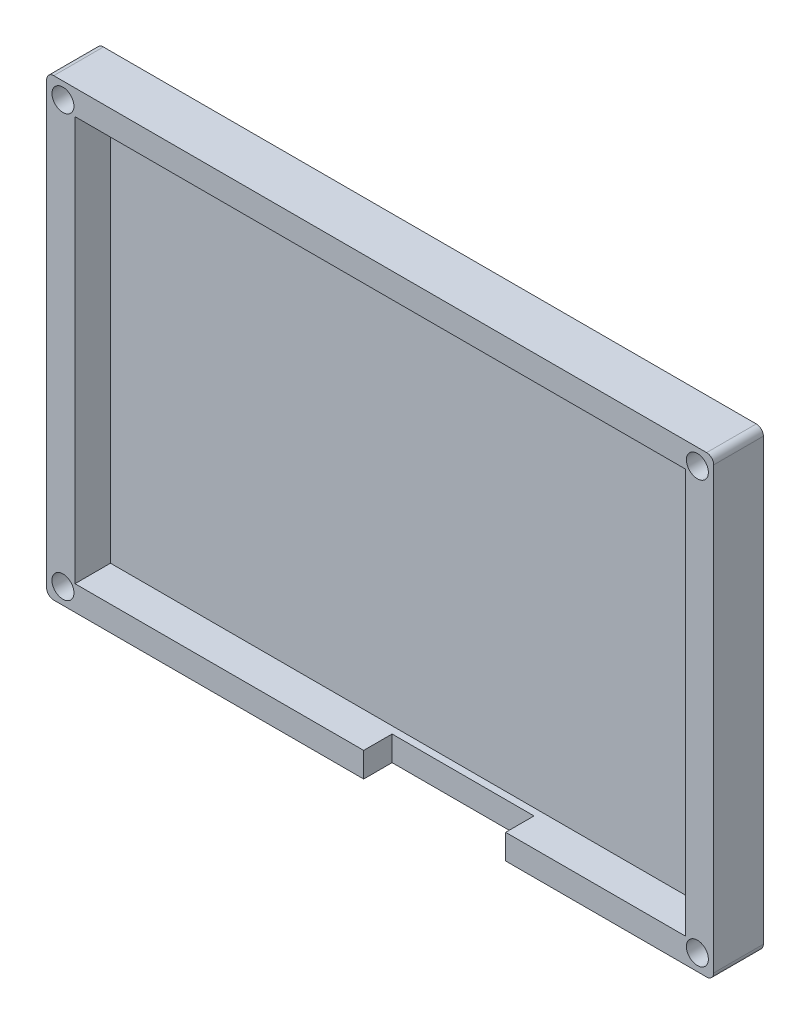
ISO-10303-21;
HEADER;
FILE_DESCRIPTION(('STEP AP214'),'2;1');
FILE_NAME('part.step','',(''),(''),'','','');
FILE_SCHEMA(('AUTOMOTIVE_DESIGN { 1 0 10303 214 1 1 1 1 }'));
ENDSEC;
DATA;
#1=APPLICATION_CONTEXT('core data for automotive mechanical design processes');
#2=APPLICATION_PROTOCOL_DEFINITION('international standard','automotive_design',2000,#1);
#3=PRODUCT_CONTEXT('',#1,'mechanical');
#4=PRODUCT('Part','Part','',(#3));
#5=PRODUCT_RELATED_PRODUCT_CATEGORY('part','',(#4));
#6=PRODUCT_DEFINITION_FORMATION('','',#4);
#7=PRODUCT_DEFINITION_CONTEXT('part definition',#1,'design');
#8=PRODUCT_DEFINITION('design','',#6,#7);
#9=PRODUCT_DEFINITION_SHAPE('','',#8);
#10=(LENGTH_UNIT() NAMED_UNIT(*) SI_UNIT(.MILLI.,.METRE.));
#11=(NAMED_UNIT(*) PLANE_ANGLE_UNIT() SI_UNIT($,.RADIAN.));
#12=(NAMED_UNIT(*) SI_UNIT($,.STERADIAN.) SOLID_ANGLE_UNIT());
#13=UNCERTAINTY_MEASURE_WITH_UNIT(LENGTH_MEASURE(1.E-05),#10,'distance_accuracy_value','');
#14=(GEOMETRIC_REPRESENTATION_CONTEXT(3) GLOBAL_UNCERTAINTY_ASSIGNED_CONTEXT((#13)) GLOBAL_UNIT_ASSIGNED_CONTEXT((#10,
#11,#12)) REPRESENTATION_CONTEXT('',''));
#15=CARTESIAN_POINT('',(0.,0.,0.));
#16=DIRECTION('',(0.,0.,1.));
#17=DIRECTION('',(1.,0.,0.));
#18=AXIS2_PLACEMENT_3D('',#15,#16,#17);
#19=CARTESIAN_POINT('',(47.,-32.,7.));
#20=DIRECTION('',(-1.,0.,0.));
#21=DIRECTION('',(0.,0.,1.));
#22=AXIS2_PLACEMENT_3D('',#19,#20,#21);
#23=PLANE('',#22);
#24=DIRECTION('',(0.,1.,0.));
#25=VECTOR('',#24,1.);
#26=CARTESIAN_POINT('',(47.,-32.,7.));
#27=LINE('',#26,#25);
#28=CARTESIAN_POINT('',(47.,-31.,7.));
#29=VERTEX_POINT('',#28);
#30=CARTESIAN_POINT('',(47.,31.,7.));
#31=VERTEX_POINT('',#30);
#32=EDGE_CURVE('E265',#29,#31,#27,.T.);
#33=ORIENTED_EDGE('',*,*,#32,.F.);
#34=DIRECTION('',(0.,0.,-1.));
#35=VECTOR('',#34,1.);
#36=CARTESIAN_POINT('',(47.,-31.,7.));
#37=LINE('',#36,#35);
#38=CARTESIAN_POINT('',(47.,-31.,0.));
#39=VERTEX_POINT('',#38);
#40=EDGE_CURVE('E299',#29,#39,#37,.T.);
#41=ORIENTED_EDGE('',*,*,#40,.T.);
#42=DIRECTION('',(0.,1.,0.));
#43=VECTOR('',#42,1.);
#44=CARTESIAN_POINT('',(47.,-32.,0.));
#45=LINE('',#44,#43);
#46=CARTESIAN_POINT('',(47.,31.,0.));
#47=VERTEX_POINT('',#46);
#48=EDGE_CURVE('E256',#39,#47,#45,.T.);
#49=ORIENTED_EDGE('',*,*,#48,.T.);
#50=DIRECTION('',(0.,0.,-1.));
#51=VECTOR('',#50,1.);
#52=CARTESIAN_POINT('',(47.,31.,7.));
#53=LINE('',#52,#51);
#54=EDGE_CURVE('E282',#47,#31,#53,.F.);
#55=ORIENTED_EDGE('',*,*,#54,.T.);
#56=EDGE_LOOP('',(#33,#41,#49,#55));
#57=FACE_BOUND('',#56,.T.);
#58=ADVANCED_FACE('F39',(#57),#23,.F.);
#59=CARTESIAN_POINT('',(-47.,32.,7.));
#60=DIRECTION('',(0.,-1.,0.));
#61=DIRECTION('',(0.,0.,-1.));
#62=AXIS2_PLACEMENT_3D('',#59,#60,#61);
#63=PLANE('',#62);
#64=DIRECTION('',(-1.,0.,0.));
#65=VECTOR('',#64,1.);
#66=CARTESIAN_POINT('',(-47.,32.,0.));
#67=LINE('',#66,#65);
#68=CARTESIAN_POINT('',(46.,32.,0.));
#69=VERTEX_POINT('',#68);
#70=CARTESIAN_POINT('',(-46.,32.,0.));
#71=VERTEX_POINT('',#70);
#72=EDGE_CURVE('E286',#69,#71,#67,.T.);
#73=ORIENTED_EDGE('',*,*,#72,.T.);
#74=DIRECTION('',(0.,0.,-1.));
#75=VECTOR('',#74,1.);
#76=CARTESIAN_POINT('',(-46.,32.,7.));
#77=LINE('',#76,#75);
#78=CARTESIAN_POINT('',(-46.,32.,7.));
#79=VERTEX_POINT('',#78);
#80=EDGE_CURVE('E346',#71,#79,#77,.F.);
#81=ORIENTED_EDGE('',*,*,#80,.T.);
#82=DIRECTION('',(-1.,0.,0.));
#83=VECTOR('',#82,1.);
#84=CARTESIAN_POINT('',(-47.,32.,7.));
#85=LINE('',#84,#83);
#86=CARTESIAN_POINT('',(46.,32.,7.));
#87=VERTEX_POINT('',#86);
#88=EDGE_CURVE('E269',#87,#79,#85,.T.);
#89=ORIENTED_EDGE('',*,*,#88,.F.);
#90=DIRECTION('',(0.,0.,-1.));
#91=VECTOR('',#90,1.);
#92=CARTESIAN_POINT('',(46.,32.,7.));
#93=LINE('',#92,#91);
#94=EDGE_CURVE('E342',#87,#69,#93,.T.);
#95=ORIENTED_EDGE('',*,*,#94,.T.);
#96=EDGE_LOOP('',(#73,#81,#89,#95));
#97=FACE_BOUND('',#96,.T.);
#98=ADVANCED_FACE('F379',(#97),#63,.F.);
#99=CARTESIAN_POINT('',(-47.,-32.,7.));
#100=DIRECTION('',(1.,0.,0.));
#101=DIRECTION('',(0.,0.,-1.));
#102=AXIS2_PLACEMENT_3D('',#99,#100,#101);
#103=PLANE('',#102);
#104=DIRECTION('',(0.,-1.,0.));
#105=VECTOR('',#104,1.);
#106=CARTESIAN_POINT('',(-47.,-32.,0.));
#107=LINE('',#106,#105);
#108=CARTESIAN_POINT('',(-47.,31.,0.));
#109=VERTEX_POINT('',#108);
#110=CARTESIAN_POINT('',(-47.,-31.,0.));
#111=VERTEX_POINT('',#110);
#112=EDGE_CURVE('E290',#109,#111,#107,.T.);
#113=ORIENTED_EDGE('',*,*,#112,.T.);
#114=DIRECTION('',(0.,0.,-1.));
#115=VECTOR('',#114,1.);
#116=CARTESIAN_POINT('',(-47.,-31.,7.));
#117=LINE('',#116,#115);
#118=CARTESIAN_POINT('',(-47.,-31.,7.));
#119=VERTEX_POINT('',#118);
#120=EDGE_CURVE('E339',#111,#119,#117,.F.);
#121=ORIENTED_EDGE('',*,*,#120,.T.);
#122=DIRECTION('',(0.,-1.,0.));
#123=VECTOR('',#122,1.);
#124=CARTESIAN_POINT('',(-47.,-32.,7.));
#125=LINE('',#124,#123);
#126=CARTESIAN_POINT('',(-47.,31.,7.));
#127=VERTEX_POINT('',#126);
#128=EDGE_CURVE('E274',#127,#119,#125,.T.);
#129=ORIENTED_EDGE('',*,*,#128,.F.);
#130=DIRECTION('',(0.,0.,-1.));
#131=VECTOR('',#130,1.);
#132=CARTESIAN_POINT('',(-47.,31.,7.));
#133=LINE('',#132,#131);
#134=EDGE_CURVE('E335',#127,#109,#133,.T.);
#135=ORIENTED_EDGE('',*,*,#134,.T.);
#136=EDGE_LOOP('',(#113,#121,#129,#135));
#137=FACE_BOUND('',#136,.T.);
#138=ADVANCED_FACE('F388',(#137),#103,.F.);
#139=CARTESIAN_POINT('',(-47.,-32.,7.));
#140=DIRECTION('',(0.,1.,0.));
#141=DIRECTION('',(0.,0.,1.));
#142=AXIS2_PLACEMENT_3D('',#139,#140,#141);
#143=PLANE('',#142);
#144=DIRECTION('',(1.,0.,0.));
#145=VECTOR('',#144,1.);
#146=CARTESIAN_POINT('',(-2.32,-32.,3.));
#147=LINE('',#146,#145);
#148=CARTESIAN_POINT('',(-2.32,-32.,3.));
#149=VERTEX_POINT('',#148);
#150=CARTESIAN_POINT('',(17.68,-32.,3.));
#151=VERTEX_POINT('',#150);
#152=EDGE_CURVE('E165',#149,#151,#147,.T.);
#153=ORIENTED_EDGE('',*,*,#152,.F.);
#154=DIRECTION('',(0.,0.,-1.));
#155=VECTOR('',#154,1.);
#156=CARTESIAN_POINT('',(-2.32,-32.,8.));
#157=LINE('',#156,#155);
#158=CARTESIAN_POINT('',(-2.32,-32.,7.));
#159=VERTEX_POINT('',#158);
#160=EDGE_CURVE('E154',#159,#149,#157,.T.);
#161=ORIENTED_EDGE('',*,*,#160,.F.);
#162=DIRECTION('',(1.,0.,0.));
#163=VECTOR('',#162,1.);
#164=CARTESIAN_POINT('',(-47.,-32.,7.));
#165=LINE('',#164,#163);
#166=CARTESIAN_POINT('',(-46.,-32.,7.));
#167=VERTEX_POINT('',#166);
#168=EDGE_CURVE('E279',#167,#159,#165,.T.);
#169=ORIENTED_EDGE('',*,*,#168,.F.);
#170=DIRECTION('',(0.,0.,-1.));
#171=VECTOR('',#170,1.);
#172=CARTESIAN_POINT('',(-46.,-32.,7.));
#173=LINE('',#172,#171);
#174=CARTESIAN_POINT('',(-46.,-32.,0.));
#175=VERTEX_POINT('',#174);
#176=EDGE_CURVE('E315',#167,#175,#173,.T.);
#177=ORIENTED_EDGE('',*,*,#176,.T.);
#178=DIRECTION('',(1.,0.,0.));
#179=VECTOR('',#178,1.);
#180=CARTESIAN_POINT('',(-47.,-32.,0.));
#181=LINE('',#180,#179);
#182=CARTESIAN_POINT('',(46.,-32.,0.));
#183=VERTEX_POINT('',#182);
#184=EDGE_CURVE('E270',#175,#183,#181,.T.);
#185=ORIENTED_EDGE('',*,*,#184,.T.);
#186=DIRECTION('',(0.,0.,-1.));
#187=VECTOR('',#186,1.);
#188=CARTESIAN_POINT('',(46.,-32.,7.));
#189=LINE('',#188,#187);
#190=CARTESIAN_POINT('',(46.,-32.,7.));
#191=VERTEX_POINT('',#190);
#192=EDGE_CURVE('E319',#183,#191,#189,.F.);
#193=ORIENTED_EDGE('',*,*,#192,.T.);
#194=CARTESIAN_POINT('',(17.68,-32.,7.));
#195=VERTEX_POINT('',#194);
#196=EDGE_CURVE('E278',#195,#191,#165,.T.);
#197=ORIENTED_EDGE('',*,*,#196,.F.);
#198=DIRECTION('',(0.,0.,1.));
#199=VECTOR('',#198,1.);
#200=CARTESIAN_POINT('',(17.68,-32.,8.));
#201=LINE('',#200,#199);
#202=EDGE_CURVE('E172',#151,#195,#201,.T.);
#203=ORIENTED_EDGE('',*,*,#202,.F.);
#204=EDGE_LOOP('',(#153,#161,#169,#177,#185,#193,#197,#203));
#205=FACE_BOUND('',#204,.T.);
#206=ADVANCED_FACE('F174',(#205),#143,.F.);
#207=CARTESIAN_POINT('',(0.,0.,7.));
#208=DIRECTION('',(0.,0.,-1.));
#209=DIRECTION('',(-1.,0.,0.));
#210=AXIS2_PLACEMENT_3D('',#207,#208,#209);
#211=PLANE('',#210);
#212=CARTESIAN_POINT('',(-44.7,-29.7,7.));
#213=DIRECTION('',(0.,0.,1.));
#214=DIRECTION('',(-1.,0.,0.));
#215=AXIS2_PLACEMENT_3D('',#212,#213,#214);
#216=CIRCLE('',#215,1.55);
#217=CARTESIAN_POINT('',(-46.25,-29.7,7.));
#218=VERTEX_POINT('',#217);
#219=EDGE_CURVE('E189',#218,#218,#216,.T.);
#220=ORIENTED_EDGE('',*,*,#219,.F.);
#221=EDGE_LOOP('',(#220));
#222=FACE_BOUND('',#221,.T.);
#223=CARTESIAN_POINT('',(44.7,-29.7,7.));
#224=DIRECTION('',(0.,0.,1.));
#225=DIRECTION('',(1.,0.,0.));
#226=AXIS2_PLACEMENT_3D('',#223,#224,#225);
#227=CIRCLE('',#226,1.55);
#228=CARTESIAN_POINT('',(46.25,-29.7,7.));
#229=VERTEX_POINT('',#228);
#230=EDGE_CURVE('E203',#229,#229,#227,.T.);
#231=ORIENTED_EDGE('',*,*,#230,.F.);
#232=EDGE_LOOP('',(#231));
#233=FACE_BOUND('',#232,.T.);
#234=CARTESIAN_POINT('',(44.7,29.7,7.));
#235=DIRECTION('',(0.,0.,1.));
#236=DIRECTION('',(-1.,0.,0.));
#237=AXIS2_PLACEMENT_3D('',#234,#235,#236);
#238=CIRCLE('',#237,1.55);
#239=CARTESIAN_POINT('',(43.15,29.7,7.));
#240=VERTEX_POINT('',#239);
#241=EDGE_CURVE('E195',#240,#240,#238,.T.);
#242=ORIENTED_EDGE('',*,*,#241,.F.);
#243=EDGE_LOOP('',(#242));
#244=FACE_BOUND('',#243,.T.);
#245=CARTESIAN_POINT('',(-44.7,29.7,7.));
#246=DIRECTION('',(0.,0.,1.));
#247=DIRECTION('',(1.,0.,0.));
#248=AXIS2_PLACEMENT_3D('',#245,#246,#247);
#249=CIRCLE('',#248,1.55);
#250=CARTESIAN_POINT('',(-43.15,29.7,7.));
#251=VERTEX_POINT('',#250);
#252=EDGE_CURVE('E194',#251,#251,#249,.T.);
#253=ORIENTED_EDGE('',*,*,#252,.F.);
#254=EDGE_LOOP('',(#253));
#255=FACE_BOUND('',#254,.T.);
#256=ORIENTED_EDGE('',*,*,#168,.T.);
#257=DIRECTION('',(0.,1.,0.));
#258=VECTOR('',#257,1.);
#259=CARTESIAN_POINT('',(-2.32,0.,7.));
#260=LINE('',#259,#258);
#261=CARTESIAN_POINT('',(-2.32,-28.5,7.));
#262=VERTEX_POINT('',#261);
#263=EDGE_CURVE('E159',#159,#262,#260,.T.);
#264=ORIENTED_EDGE('',*,*,#263,.T.);
#265=DIRECTION('',(1.,0.,0.));
#266=VECTOR('',#265,1.);
#267=CARTESIAN_POINT('',(-43.,-28.5,7.));
#268=LINE('',#267,#266);
#269=CARTESIAN_POINT('',(-43.,-28.5,7.));
#270=VERTEX_POINT('',#269);
#271=EDGE_CURVE('E226',#270,#262,#268,.T.);
#272=ORIENTED_EDGE('',*,*,#271,.F.);
#273=DIRECTION('',(0.,-1.,0.));
#274=VECTOR('',#273,1.);
#275=CARTESIAN_POINT('',(-43.,-28.5,7.));
#276=LINE('',#275,#274);
#277=CARTESIAN_POINT('',(-43.,28.5,7.));
#278=VERTEX_POINT('',#277);
#279=EDGE_CURVE('E245',#278,#270,#276,.T.);
#280=ORIENTED_EDGE('',*,*,#279,.F.);
#281=DIRECTION('',(-1.,0.,0.));
#282=VECTOR('',#281,1.);
#283=CARTESIAN_POINT('',(-43.,28.5,7.));
#284=LINE('',#283,#282);
#285=CARTESIAN_POINT('',(43.,28.5,7.));
#286=VERTEX_POINT('',#285);
#287=EDGE_CURVE('E241',#286,#278,#284,.T.);
#288=ORIENTED_EDGE('',*,*,#287,.F.);
#289=DIRECTION('',(0.,1.,0.));
#290=VECTOR('',#289,1.);
#291=CARTESIAN_POINT('',(43.,-28.5,7.));
#292=LINE('',#291,#290);
#293=CARTESIAN_POINT('',(43.,-28.5,7.));
#294=VERTEX_POINT('',#293);
#295=EDGE_CURVE('E63',#294,#286,#292,.T.);
#296=ORIENTED_EDGE('',*,*,#295,.F.);
#297=CARTESIAN_POINT('',(17.68,-28.5,7.));
#298=VERTEX_POINT('',#297);
#299=EDGE_CURVE('E249',#298,#294,#268,.T.);
#300=ORIENTED_EDGE('',*,*,#299,.F.);
#301=DIRECTION('',(0.,-1.,0.));
#302=VECTOR('',#301,1.);
#303=CARTESIAN_POINT('',(17.68,0.,7.));
#304=LINE('',#303,#302);
#305=EDGE_CURVE('E182',#298,#195,#304,.T.);
#306=ORIENTED_EDGE('',*,*,#305,.T.);
#307=ORIENTED_EDGE('',*,*,#196,.T.);
#308=CARTESIAN_POINT('',(46.,-31.,7.));
#309=DIRECTION('',(0.,0.,-1.));
#310=DIRECTION('',(-1.,0.,0.));
#311=AXIS2_PLACEMENT_3D('',#308,#309,#310);
#312=CIRCLE('',#311,1.);
#313=EDGE_CURVE('E332',#191,#29,#312,.F.);
#314=ORIENTED_EDGE('',*,*,#313,.T.);
#315=ORIENTED_EDGE('',*,*,#32,.T.);
#316=CARTESIAN_POINT('',(46.,31.,7.));
#317=DIRECTION('',(0.,0.,-1.));
#318=DIRECTION('',(-1.,0.,0.));
#319=AXIS2_PLACEMENT_3D('',#316,#317,#318);
#320=CIRCLE('',#319,1.);
#321=EDGE_CURVE('E323',#31,#87,#320,.F.);
#322=ORIENTED_EDGE('',*,*,#321,.T.);
#323=ORIENTED_EDGE('',*,*,#88,.T.);
#324=CARTESIAN_POINT('',(-46.,31.,7.));
#325=DIRECTION('',(0.,0.,-1.));
#326=DIRECTION('',(-1.,0.,0.));
#327=AXIS2_PLACEMENT_3D('',#324,#325,#326);
#328=CIRCLE('',#327,1.);
#329=EDGE_CURVE('E326',#79,#127,#328,.F.);
#330=ORIENTED_EDGE('',*,*,#329,.T.);
#331=ORIENTED_EDGE('',*,*,#128,.T.);
#332=CARTESIAN_POINT('',(-46.,-31.,7.));
#333=DIRECTION('',(0.,0.,-1.));
#334=DIRECTION('',(-1.,0.,0.));
#335=AXIS2_PLACEMENT_3D('',#332,#333,#334);
#336=CIRCLE('',#335,1.);
#337=EDGE_CURVE('E329',#119,#167,#336,.F.);
#338=ORIENTED_EDGE('',*,*,#337,.T.);
#339=EDGE_LOOP('',(#256,#264,#272,#280,#288,#296,#300,#306,#307,#314,#315,#322,#323,#330,#331,#338));
#340=FACE_BOUND('',#339,.T.);
#341=ADVANCED_FACE('F357',(#222,#233,#244,#255,#340),#211,.F.);
#342=CARTESIAN_POINT('',(0.,0.,0.));
#343=DIRECTION('',(0.,0.,-1.));
#344=DIRECTION('',(-1.,0.,0.));
#345=AXIS2_PLACEMENT_3D('',#342,#343,#344);
#346=PLANE('',#345);
#347=CARTESIAN_POINT('',(-44.7,-29.7,0.));
#348=DIRECTION('',(0.,0.,1.));
#349=DIRECTION('',(-1.,0.,0.));
#350=AXIS2_PLACEMENT_3D('',#347,#348,#349);
#351=CIRCLE('',#350,1.55);
#352=CARTESIAN_POINT('',(-46.25,-29.7,0.));
#353=VERTEX_POINT('',#352);
#354=EDGE_CURVE('E207',#353,#353,#351,.T.);
#355=ORIENTED_EDGE('',*,*,#354,.T.);
#356=EDGE_LOOP('',(#355));
#357=FACE_BOUND('',#356,.T.);
#358=CARTESIAN_POINT('',(44.7,-29.7,0.));
#359=DIRECTION('',(0.,0.,1.));
#360=DIRECTION('',(1.,0.,0.));
#361=AXIS2_PLACEMENT_3D('',#358,#359,#360);
#362=CIRCLE('',#361,1.55);
#363=CARTESIAN_POINT('',(46.25,-29.7,0.));
#364=VERTEX_POINT('',#363);
#365=EDGE_CURVE('E199',#364,#364,#362,.T.);
#366=ORIENTED_EDGE('',*,*,#365,.T.);
#367=EDGE_LOOP('',(#366));
#368=FACE_BOUND('',#367,.T.);
#369=CARTESIAN_POINT('',(44.7,29.7,0.));
#370=DIRECTION('',(0.,0.,1.));
#371=DIRECTION('',(-1.,0.,0.));
#372=AXIS2_PLACEMENT_3D('',#369,#370,#371);
#373=CIRCLE('',#372,1.55);
#374=CARTESIAN_POINT('',(43.15,29.7,0.));
#375=VERTEX_POINT('',#374);
#376=EDGE_CURVE('E190',#375,#375,#373,.T.);
#377=ORIENTED_EDGE('',*,*,#376,.T.);
#378=EDGE_LOOP('',(#377));
#379=FACE_BOUND('',#378,.T.);
#380=CARTESIAN_POINT('',(-44.7,29.7,0.));
#381=DIRECTION('',(0.,0.,1.));
#382=DIRECTION('',(1.,0.,0.));
#383=AXIS2_PLACEMENT_3D('',#380,#381,#382);
#384=CIRCLE('',#383,1.55);
#385=CARTESIAN_POINT('',(-43.15,29.7,0.));
#386=VERTEX_POINT('',#385);
#387=EDGE_CURVE('E214',#386,#386,#384,.T.);
#388=ORIENTED_EDGE('',*,*,#387,.T.);
#389=EDGE_LOOP('',(#388));
#390=FACE_BOUND('',#389,.T.);
#391=ORIENTED_EDGE('',*,*,#48,.F.);
#392=CARTESIAN_POINT('',(46.,-31.,0.));
#393=DIRECTION('',(0.,0.,-1.));
#394=DIRECTION('',(-1.,0.,0.));
#395=AXIS2_PLACEMENT_3D('',#392,#393,#394);
#396=CIRCLE('',#395,1.);
#397=EDGE_CURVE('E312',#39,#183,#396,.T.);
#398=ORIENTED_EDGE('',*,*,#397,.T.);
#399=ORIENTED_EDGE('',*,*,#184,.F.);
#400=CARTESIAN_POINT('',(-46.,-31.,0.));
#401=DIRECTION('',(0.,0.,-1.));
#402=DIRECTION('',(-1.,0.,0.));
#403=AXIS2_PLACEMENT_3D('',#400,#401,#402);
#404=CIRCLE('',#403,1.);
#405=EDGE_CURVE('E309',#175,#111,#404,.T.);
#406=ORIENTED_EDGE('',*,*,#405,.T.);
#407=ORIENTED_EDGE('',*,*,#112,.F.);
#408=CARTESIAN_POINT('',(-46.,31.,0.));
#409=DIRECTION('',(0.,0.,-1.));
#410=DIRECTION('',(-1.,0.,0.));
#411=AXIS2_PLACEMENT_3D('',#408,#409,#410);
#412=CIRCLE('',#411,1.);
#413=EDGE_CURVE('E306',#109,#71,#412,.T.);
#414=ORIENTED_EDGE('',*,*,#413,.T.);
#415=ORIENTED_EDGE('',*,*,#72,.F.);
#416=CARTESIAN_POINT('',(46.,31.,0.));
#417=DIRECTION('',(0.,0.,-1.));
#418=DIRECTION('',(-1.,0.,0.));
#419=AXIS2_PLACEMENT_3D('',#416,#417,#418);
#420=CIRCLE('',#419,1.);
#421=EDGE_CURVE('E303',#69,#47,#420,.T.);
#422=ORIENTED_EDGE('',*,*,#421,.T.);
#423=EDGE_LOOP('',(#391,#398,#399,#406,#407,#414,#415,#422));
#424=FACE_BOUND('',#423,.T.);
#425=ADVANCED_FACE('F372',(#357,#368,#379,#390,#424),#346,.T.);
#426=CARTESIAN_POINT('',(46.,-31.,7.));
#427=DIRECTION('',(0.,0.,-1.));
#428=DIRECTION('',(-1.,0.,0.));
#429=AXIS2_PLACEMENT_3D('',#426,#427,#428);
#430=CYLINDRICAL_SURFACE('',#429,1.);
#431=ORIENTED_EDGE('',*,*,#313,.F.);
#432=ORIENTED_EDGE('',*,*,#192,.F.);
#433=ORIENTED_EDGE('',*,*,#397,.F.);
#434=ORIENTED_EDGE('',*,*,#40,.F.);
#435=EDGE_LOOP('',(#431,#432,#433,#434));
#436=FACE_BOUND('',#435,.T.);
#437=ADVANCED_FACE('F367',(#436),#430,.T.);
#438=CARTESIAN_POINT('',(-46.,-31.,7.));
#439=DIRECTION('',(0.,0.,-1.));
#440=DIRECTION('',(-1.,0.,0.));
#441=AXIS2_PLACEMENT_3D('',#438,#439,#440);
#442=CYLINDRICAL_SURFACE('',#441,1.);
#443=ORIENTED_EDGE('',*,*,#337,.F.);
#444=ORIENTED_EDGE('',*,*,#120,.F.);
#445=ORIENTED_EDGE('',*,*,#405,.F.);
#446=ORIENTED_EDGE('',*,*,#176,.F.);
#447=EDGE_LOOP('',(#443,#444,#445,#446));
#448=FACE_BOUND('',#447,.T.);
#449=ADVANCED_FACE('F393',(#448),#442,.T.);
#450=CARTESIAN_POINT('',(-46.,31.,7.));
#451=DIRECTION('',(0.,0.,-1.));
#452=DIRECTION('',(-1.,0.,0.));
#453=AXIS2_PLACEMENT_3D('',#450,#451,#452);
#454=CYLINDRICAL_SURFACE('',#453,1.);
#455=ORIENTED_EDGE('',*,*,#329,.F.);
#456=ORIENTED_EDGE('',*,*,#80,.F.);
#457=ORIENTED_EDGE('',*,*,#413,.F.);
#458=ORIENTED_EDGE('',*,*,#134,.F.);
#459=EDGE_LOOP('',(#455,#456,#457,#458));
#460=FACE_BOUND('',#459,.T.);
#461=ADVANCED_FACE('F385',(#460),#454,.T.);
#462=CARTESIAN_POINT('',(46.,31.,7.));
#463=DIRECTION('',(0.,0.,-1.));
#464=DIRECTION('',(-1.,0.,0.));
#465=AXIS2_PLACEMENT_3D('',#462,#463,#464);
#466=CYLINDRICAL_SURFACE('',#465,1.);
#467=ORIENTED_EDGE('',*,*,#321,.F.);
#468=ORIENTED_EDGE('',*,*,#54,.F.);
#469=ORIENTED_EDGE('',*,*,#421,.F.);
#470=ORIENTED_EDGE('',*,*,#94,.F.);
#471=EDGE_LOOP('',(#467,#468,#469,#470));
#472=FACE_BOUND('',#471,.T.);
#473=ADVANCED_FACE('F41',(#472),#466,.T.);
#474=CARTESIAN_POINT('',(43.,-28.5,2.));
#475=DIRECTION('',(1.,0.,0.));
#476=DIRECTION('',(0.,0.,-1.));
#477=AXIS2_PLACEMENT_3D('',#474,#475,#476);
#478=PLANE('',#477);
#479=ORIENTED_EDGE('',*,*,#295,.T.);
#480=DIRECTION('',(0.,0.,1.));
#481=VECTOR('',#480,1.);
#482=CARTESIAN_POINT('',(43.,28.5,2.));
#483=LINE('',#482,#481);
#484=CARTESIAN_POINT('',(43.,28.5,2.));
#485=VERTEX_POINT('',#484);
#486=EDGE_CURVE('E238',#485,#286,#483,.T.);
#487=ORIENTED_EDGE('',*,*,#486,.F.);
#488=DIRECTION('',(0.,1.,0.));
#489=VECTOR('',#488,1.);
#490=CARTESIAN_POINT('',(43.,-28.5,2.));
#491=LINE('',#490,#489);
#492=CARTESIAN_POINT('',(43.,-28.5,2.));
#493=VERTEX_POINT('',#492);
#494=EDGE_CURVE('E221',#493,#485,#491,.T.);
#495=ORIENTED_EDGE('',*,*,#494,.F.);
#496=DIRECTION('',(0.,0.,1.));
#497=VECTOR('',#496,1.);
#498=CARTESIAN_POINT('',(43.,-28.5,2.));
#499=LINE('',#498,#497);
#500=EDGE_CURVE('E253',#493,#294,#499,.T.);
#501=ORIENTED_EDGE('',*,*,#500,.T.);
#502=EDGE_LOOP('',(#479,#487,#495,#501));
#503=FACE_BOUND('',#502,.T.);
#504=ADVANCED_FACE('F404',(#503),#478,.F.);
#505=CARTESIAN_POINT('',(-43.,-28.5,2.));
#506=DIRECTION('',(0.,-1.,0.));
#507=DIRECTION('',(0.,0.,-1.));
#508=AXIS2_PLACEMENT_3D('',#505,#506,#507);
#509=PLANE('',#508);
#510=ORIENTED_EDGE('',*,*,#271,.T.);
#511=DIRECTION('',(0.,0.,-1.));
#512=VECTOR('',#511,1.);
#513=CARTESIAN_POINT('',(-2.32,-28.5,2.00000000000001));
#514=LINE('',#513,#512);
#515=CARTESIAN_POINT('',(-2.32,-28.5,3.));
#516=VERTEX_POINT('',#515);
#517=EDGE_CURVE('E11',#262,#516,#514,.T.);
#518=ORIENTED_EDGE('',*,*,#517,.T.);
#519=DIRECTION('',(1.,0.,0.));
#520=VECTOR('',#519,1.);
#521=CARTESIAN_POINT('',(-43.,-28.5,3.));
#522=LINE('',#521,#520);
#523=CARTESIAN_POINT('',(17.68,-28.5,3.));
#524=VERTEX_POINT('',#523);
#525=EDGE_CURVE('E170',#516,#524,#522,.T.);
#526=ORIENTED_EDGE('',*,*,#525,.T.);
#527=DIRECTION('',(0.,0.,1.));
#528=VECTOR('',#527,1.);
#529=CARTESIAN_POINT('',(17.68,-28.5,2.));
#530=LINE('',#529,#528);
#531=EDGE_CURVE('E48',#524,#298,#530,.T.);
#532=ORIENTED_EDGE('',*,*,#531,.T.);
#533=ORIENTED_EDGE('',*,*,#299,.T.);
#534=ORIENTED_EDGE('',*,*,#500,.F.);
#535=DIRECTION('',(1.,0.,0.));
#536=VECTOR('',#535,1.);
#537=CARTESIAN_POINT('',(-43.,-28.5,2.));
#538=LINE('',#537,#536);
#539=CARTESIAN_POINT('',(-43.,-28.5,2.));
#540=VERTEX_POINT('',#539);
#541=EDGE_CURVE('E234',#540,#493,#538,.T.);
#542=ORIENTED_EDGE('',*,*,#541,.F.);
#543=DIRECTION('',(0.,0.,1.));
#544=VECTOR('',#543,1.);
#545=CARTESIAN_POINT('',(-43.,-28.5,2.));
#546=LINE('',#545,#544);
#547=EDGE_CURVE('E257',#540,#270,#546,.T.);
#548=ORIENTED_EDGE('',*,*,#547,.T.);
#549=EDGE_LOOP('',(#510,#518,#526,#532,#533,#534,#542,#548));
#550=FACE_BOUND('',#549,.T.);
#551=ADVANCED_FACE('F354',(#550),#509,.F.);
#552=CARTESIAN_POINT('',(-43.,-28.5,2.));
#553=DIRECTION('',(-1.,0.,0.));
#554=DIRECTION('',(0.,0.,1.));
#555=AXIS2_PLACEMENT_3D('',#552,#553,#554);
#556=PLANE('',#555);
#557=ORIENTED_EDGE('',*,*,#279,.T.);
#558=ORIENTED_EDGE('',*,*,#547,.F.);
#559=DIRECTION('',(0.,-1.,0.));
#560=VECTOR('',#559,1.);
#561=CARTESIAN_POINT('',(-43.,-28.5,2.));
#562=LINE('',#561,#560);
#563=CARTESIAN_POINT('',(-43.,28.5,2.));
#564=VERTEX_POINT('',#563);
#565=EDGE_CURVE('E230',#564,#540,#562,.T.);
#566=ORIENTED_EDGE('',*,*,#565,.F.);
#567=DIRECTION('',(0.,0.,1.));
#568=VECTOR('',#567,1.);
#569=CARTESIAN_POINT('',(-43.,28.5,2.));
#570=LINE('',#569,#568);
#571=EDGE_CURVE('E260',#564,#278,#570,.T.);
#572=ORIENTED_EDGE('',*,*,#571,.T.);
#573=EDGE_LOOP('',(#557,#558,#566,#572));
#574=FACE_BOUND('',#573,.T.);
#575=ADVANCED_FACE('F399',(#574),#556,.F.);
#576=CARTESIAN_POINT('',(-43.,28.5,2.));
#577=DIRECTION('',(0.,1.,0.));
#578=DIRECTION('',(0.,0.,1.));
#579=AXIS2_PLACEMENT_3D('',#576,#577,#578);
#580=PLANE('',#579);
#581=ORIENTED_EDGE('',*,*,#287,.T.);
#582=ORIENTED_EDGE('',*,*,#571,.F.);
#583=DIRECTION('',(-1.,0.,0.));
#584=VECTOR('',#583,1.);
#585=CARTESIAN_POINT('',(-43.,28.5,2.));
#586=LINE('',#585,#584);
#587=EDGE_CURVE('E225',#485,#564,#586,.T.);
#588=ORIENTED_EDGE('',*,*,#587,.F.);
#589=ORIENTED_EDGE('',*,*,#486,.T.);
#590=EDGE_LOOP('',(#581,#582,#588,#589));
#591=FACE_BOUND('',#590,.T.);
#592=ADVANCED_FACE('F401',(#591),#580,.F.);
#593=CARTESIAN_POINT('',(0.,0.,2.));
#594=DIRECTION('',(0.,0.,-1.));
#595=DIRECTION('',(-1.,0.,0.));
#596=AXIS2_PLACEMENT_3D('',#593,#594,#595);
#597=PLANE('',#596);
#598=ORIENTED_EDGE('',*,*,#494,.T.);
#599=ORIENTED_EDGE('',*,*,#587,.T.);
#600=ORIENTED_EDGE('',*,*,#565,.T.);
#601=ORIENTED_EDGE('',*,*,#541,.T.);
#602=EDGE_LOOP('',(#598,#599,#600,#601));
#603=FACE_BOUND('',#602,.T.);
#604=ADVANCED_FACE('F406',(#603),#597,.F.);
#605=CARTESIAN_POINT('',(-44.7,29.7,0.));
#606=DIRECTION('',(0.,0.,1.));
#607=DIRECTION('',(1.,0.,0.));
#608=AXIS2_PLACEMENT_3D('',#605,#606,#607);
#609=CYLINDRICAL_SURFACE('',#608,1.55);
#610=ORIENTED_EDGE('',*,*,#387,.F.);
#611=EDGE_LOOP('',(#610));
#612=FACE_BOUND('',#611,.T.);
#613=ORIENTED_EDGE('',*,*,#252,.T.);
#614=EDGE_LOOP('',(#613));
#615=FACE_BOUND('',#614,.T.);
#616=ADVANCED_FACE('F408',(#612,#615),#609,.F.);
#617=CARTESIAN_POINT('',(44.7,29.7,0.));
#618=DIRECTION('',(0.,0.,1.));
#619=DIRECTION('',(1.,0.,0.));
#620=AXIS2_PLACEMENT_3D('',#617,#618,#619);
#621=CYLINDRICAL_SURFACE('',#620,1.55);
#622=ORIENTED_EDGE('',*,*,#376,.F.);
#623=EDGE_LOOP('',(#622));
#624=FACE_BOUND('',#623,.T.);
#625=ORIENTED_EDGE('',*,*,#241,.T.);
#626=EDGE_LOOP('',(#625));
#627=FACE_BOUND('',#626,.T.);
#628=ADVANCED_FACE('F414',(#624,#627),#621,.F.);
#629=CARTESIAN_POINT('',(44.7,-29.7,0.));
#630=DIRECTION('',(0.,0.,1.));
#631=DIRECTION('',(1.,0.,0.));
#632=AXIS2_PLACEMENT_3D('',#629,#630,#631);
#633=CYLINDRICAL_SURFACE('',#632,1.55);
#634=ORIENTED_EDGE('',*,*,#365,.F.);
#635=EDGE_LOOP('',(#634));
#636=FACE_BOUND('',#635,.T.);
#637=ORIENTED_EDGE('',*,*,#230,.T.);
#638=EDGE_LOOP('',(#637));
#639=FACE_BOUND('',#638,.T.);
#640=ADVANCED_FACE('F522',(#636,#639),#633,.F.);
#641=CARTESIAN_POINT('',(-44.7,-29.7,0.));
#642=DIRECTION('',(0.,0.,1.));
#643=DIRECTION('',(1.,0.,0.));
#644=AXIS2_PLACEMENT_3D('',#641,#642,#643);
#645=CYLINDRICAL_SURFACE('',#644,1.55);
#646=ORIENTED_EDGE('',*,*,#354,.F.);
#647=EDGE_LOOP('',(#646));
#648=FACE_BOUND('',#647,.T.);
#649=ORIENTED_EDGE('',*,*,#219,.T.);
#650=EDGE_LOOP('',(#649));
#651=FACE_BOUND('',#650,.T.);
#652=ADVANCED_FACE('F531',(#648,#651),#645,.F.);
#653=CARTESIAN_POINT('',(-2.32,-27.,8.));
#654=DIRECTION('',(-1.,0.,0.));
#655=DIRECTION('',(0.,0.,1.));
#656=AXIS2_PLACEMENT_3D('',#653,#654,#655);
#657=PLANE('',#656);
#658=ORIENTED_EDGE('',*,*,#160,.T.);
#659=DIRECTION('',(0.,-1.,0.));
#660=VECTOR('',#659,1.);
#661=CARTESIAN_POINT('',(-2.32,-27.,3.));
#662=LINE('',#661,#660);
#663=EDGE_CURVE('E157',#516,#149,#662,.T.);
#664=ORIENTED_EDGE('',*,*,#663,.F.);
#665=ORIENTED_EDGE('',*,*,#517,.F.);
#666=ORIENTED_EDGE('',*,*,#263,.F.);
#667=EDGE_LOOP('',(#658,#664,#665,#666));
#668=FACE_BOUND('',#667,.T.);
#669=ADVANCED_FACE('F156',(#668),#657,.F.);
#670=CARTESIAN_POINT('',(17.68,-27.,8.));
#671=DIRECTION('',(1.,0.,0.));
#672=DIRECTION('',(0.,0.,-1.));
#673=AXIS2_PLACEMENT_3D('',#670,#671,#672);
#674=PLANE('',#673);
#675=ORIENTED_EDGE('',*,*,#531,.F.);
#676=DIRECTION('',(0.,-1.,0.));
#677=VECTOR('',#676,1.);
#678=CARTESIAN_POINT('',(17.68,-27.,3.));
#679=LINE('',#678,#677);
#680=EDGE_CURVE('E55',#524,#151,#679,.T.);
#681=ORIENTED_EDGE('',*,*,#680,.T.);
#682=ORIENTED_EDGE('',*,*,#202,.T.);
#683=ORIENTED_EDGE('',*,*,#305,.F.);
#684=EDGE_LOOP('',(#675,#681,#682,#683));
#685=FACE_BOUND('',#684,.T.);
#686=ADVANCED_FACE('F547',(#685),#674,.F.);
#687=CARTESIAN_POINT('',(-2.32,-27.,3.));
#688=DIRECTION('',(0.,0.,-1.));
#689=DIRECTION('',(-1.,0.,0.));
#690=AXIS2_PLACEMENT_3D('',#687,#688,#689);
#691=PLANE('',#690);
#692=ORIENTED_EDGE('',*,*,#663,.T.);
#693=ORIENTED_EDGE('',*,*,#152,.T.);
#694=ORIENTED_EDGE('',*,*,#680,.F.);
#695=ORIENTED_EDGE('',*,*,#525,.F.);
#696=EDGE_LOOP('',(#692,#693,#694,#695));
#697=FACE_BOUND('',#696,.T.);
#698=ADVANCED_FACE('F167',(#697),#691,.F.);
#699=CLOSED_SHELL('',(#58,#98,#138,#206,#341,#425,#437,#449,#461,#473,#504,#551,#575,#592,#604,
#616,#628,#640,#652,#669,#686,#698));
#700=MANIFOLD_SOLID_BREP('B2',#699);
#701=ADVANCED_BREP_SHAPE_REPRESENTATION('',(#18,#700),#14);
#702=SHAPE_DEFINITION_REPRESENTATION(#9,#701);
ENDSEC;
END-ISO-10303-21;
